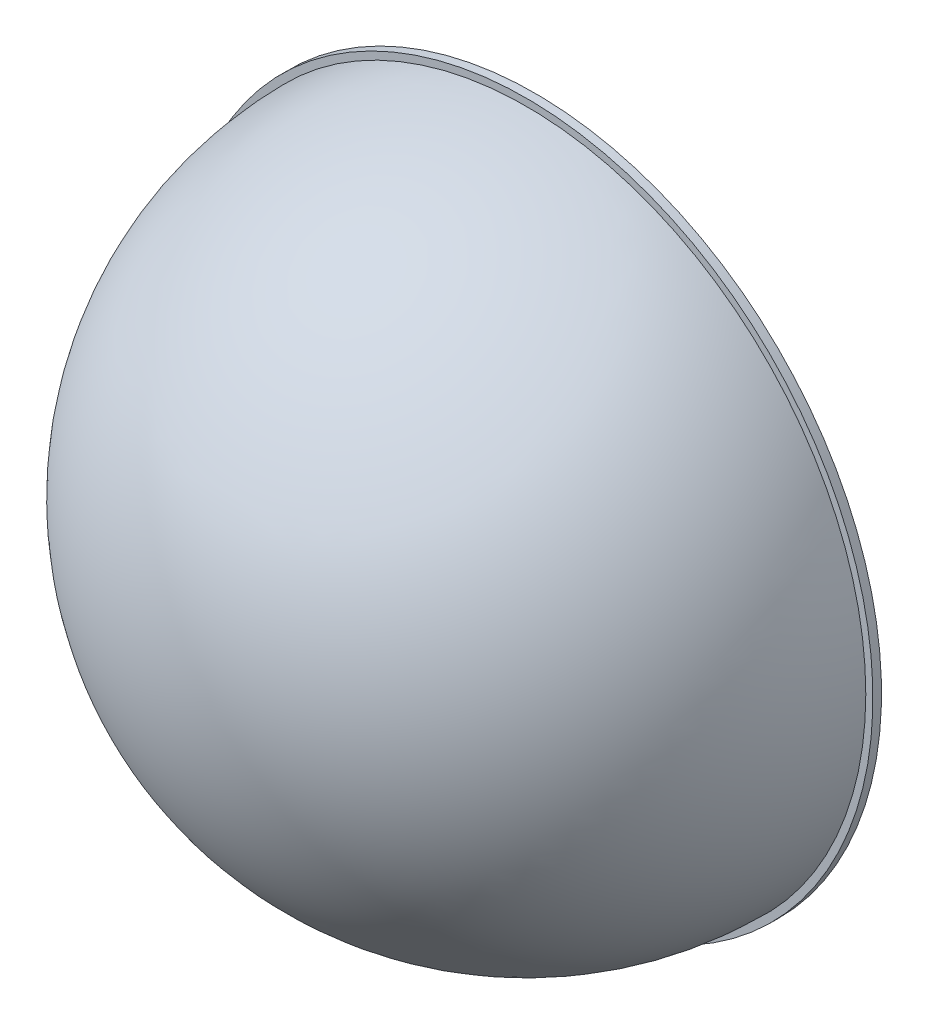
ISO-10303-21;
HEADER;
FILE_DESCRIPTION(('STEP AP214'),'2;1');
FILE_NAME('part.step','',(''),(''),'','','');
FILE_SCHEMA(('AUTOMOTIVE_DESIGN { 1 0 10303 214 1 1 1 1 }'));
ENDSEC;
DATA;
#1=APPLICATION_CONTEXT('core data for automotive mechanical design processes');
#2=APPLICATION_PROTOCOL_DEFINITION('international standard','automotive_design',2000,#1);
#3=PRODUCT_CONTEXT('',#1,'mechanical');
#4=PRODUCT('Part','Part','',(#3));
#5=PRODUCT_RELATED_PRODUCT_CATEGORY('part','',(#4));
#6=PRODUCT_DEFINITION_FORMATION('','',#4);
#7=PRODUCT_DEFINITION_CONTEXT('part definition',#1,'design');
#8=PRODUCT_DEFINITION('design','',#6,#7);
#9=PRODUCT_DEFINITION_SHAPE('','',#8);
#10=(LENGTH_UNIT() NAMED_UNIT(*) SI_UNIT(.MILLI.,.METRE.));
#11=(NAMED_UNIT(*) PLANE_ANGLE_UNIT() SI_UNIT($,.RADIAN.));
#12=(NAMED_UNIT(*) SI_UNIT($,.STERADIAN.) SOLID_ANGLE_UNIT());
#13=UNCERTAINTY_MEASURE_WITH_UNIT(LENGTH_MEASURE(1.E-05),#10,'distance_accuracy_value','');
#14=(GEOMETRIC_REPRESENTATION_CONTEXT(3) GLOBAL_UNCERTAINTY_ASSIGNED_CONTEXT((#13)) GLOBAL_UNIT_ASSIGNED_CONTEXT((#10,
#11,#12)) REPRESENTATION_CONTEXT('',''));
#15=CARTESIAN_POINT('',(0.,0.,0.));
#16=DIRECTION('',(0.,0.,1.));
#17=DIRECTION('',(1.,0.,0.));
#18=AXIS2_PLACEMENT_3D('',#15,#16,#17);
#19=CARTESIAN_POINT('',(0.,0.,0.));
#20=DIRECTION('',(0.,-1.,0.));
#21=DIRECTION('',(1.,0.,0.));
#22=AXIS2_PLACEMENT_3D('',#19,#20,#21);
#23=SPHERICAL_SURFACE('',#22,78.85);
#24=CARTESIAN_POINT('',(0.,0.,0.));
#25=DIRECTION('',(0.,0.,-1.));
#26=DIRECTION('',(-1.,0.,0.));
#27=AXIS2_PLACEMENT_3D('',#24,#25,#26);
#28=SPHERICAL_SURFACE('',#27,78.85);
#29=CARTESIAN_POINT('',(0.,0.,0.));
#30=DIRECTION('',(0.,0.,-1.));
#31=DIRECTION('',(-1.,0.,0.));
#32=AXIS2_PLACEMENT_3D('',#29,#30,#31);
#33=CIRCLE('',#32,78.85);
#34=CARTESIAN_POINT('',(-78.85,0.,3.04272323601612E-13));
#35=VERTEX_POINT('',#34);
#36=EDGE_CURVE('E10',#35,#35,#33,.T.);
#37=ORIENTED_EDGE('',*,*,#36,.F.);
#38=EDGE_LOOP('',(#37));
#39=FACE_BOUND('',#38,.T.);
#40=ADVANCED_FACE('F33',(#39),#28,.T.);
#41=CARTESIAN_POINT('',(0.,0.,0.));
#42=DIRECTION('',(0.,0.,-1.));
#43=DIRECTION('',(-1.,0.,0.));
#44=AXIS2_PLACEMENT_3D('',#41,#42,#43);
#45=PLANE('',#44);
#46=CARTESIAN_POINT('',(0.,0.,0.));
#47=DIRECTION('',(0.,0.,-1.));
#48=DIRECTION('',(-1.,0.,0.));
#49=AXIS2_PLACEMENT_3D('',#46,#47,#48);
#50=CIRCLE('',#49,80.5);
#51=CARTESIAN_POINT('',(-80.5,0.,2.81064247776872E-13));
#52=VERTEX_POINT('',#51);
#53=EDGE_CURVE('E43',#52,#52,#50,.T.);
#54=ORIENTED_EDGE('',*,*,#53,.F.);
#55=EDGE_LOOP('',(#54));
#56=FACE_BOUND('',#55,.T.);
#57=ORIENTED_EDGE('',*,*,#36,.T.);
#58=EDGE_LOOP('',(#57));
#59=FACE_BOUND('',#58,.T.);
#60=ADVANCED_FACE('F62',(#56,#59),#45,.F.);
#61=CARTESIAN_POINT('',(0.,0.,-2.));
#62=DIRECTION('',(0.,0.,-1.));
#63=DIRECTION('',(-1.,0.,0.));
#64=AXIS2_PLACEMENT_3D('',#61,#62,#63);
#65=PLANE('',#64);
#66=CARTESIAN_POINT('',(0.,0.,-2.));
#67=DIRECTION('',(0.,0.,-1.));
#68=DIRECTION('',(-1.,0.,0.));
#69=AXIS2_PLACEMENT_3D('',#66,#67,#68);
#70=CIRCLE('',#69,80.5);
#71=CARTESIAN_POINT('',(-80.5,0.,-1.99999999999972));
#72=VERTEX_POINT('',#71);
#73=EDGE_CURVE('E39',#72,#72,#70,.T.);
#74=ORIENTED_EDGE('',*,*,#73,.T.);
#75=EDGE_LOOP('',(#74));
#76=FACE_BOUND('',#75,.T.);
#77=CARTESIAN_POINT('',(0.,0.,-2.));
#78=DIRECTION('',(0.,0.,-1.));
#79=DIRECTION('',(-1.,0.,0.));
#80=AXIS2_PLACEMENT_3D('',#77,#78,#79);
#81=CIRCLE('',#80,76.85);
#82=CARTESIAN_POINT('',(-76.85,0.,-1.99999999999973));
#83=VERTEX_POINT('',#82);
#84=EDGE_CURVE('E48',#83,#83,#81,.T.);
#85=ORIENTED_EDGE('',*,*,#84,.F.);
#86=EDGE_LOOP('',(#85));
#87=FACE_BOUND('',#86,.T.);
#88=ADVANCED_FACE('F59',(#76,#87),#65,.T.);
#89=CARTESIAN_POINT('',(0.,0.,-2.));
#90=DIRECTION('',(0.,0.,1.));
#91=DIRECTION('',(1.,0.,0.));
#92=AXIS2_PLACEMENT_3D('',#89,#90,#91);
#93=CYLINDRICAL_SURFACE('',#92,80.5);
#94=ORIENTED_EDGE('',*,*,#73,.F.);
#95=EDGE_LOOP('',(#94));
#96=FACE_BOUND('',#95,.T.);
#97=ORIENTED_EDGE('',*,*,#53,.T.);
#98=EDGE_LOOP('',(#97));
#99=FACE_BOUND('',#98,.T.);
#100=ADVANCED_FACE('F61',(#96,#99),#93,.T.);
#101=CARTESIAN_POINT('',(0.,0.,-2.));
#102=DIRECTION('',(0.,0.,1.));
#103=DIRECTION('',(1.,0.,0.));
#104=AXIS2_PLACEMENT_3D('',#101,#102,#103);
#105=CYLINDRICAL_SURFACE('',#104,76.85);
#106=ORIENTED_EDGE('',*,*,#84,.T.);
#107=EDGE_LOOP('',(#106));
#108=FACE_BOUND('',#107,.T.);
#109=CARTESIAN_POINT('',(0.,0.,0.));
#110=DIRECTION('',(0.,0.,-1.));
#111=DIRECTION('',(-1.,0.,0.));
#112=AXIS2_PLACEMENT_3D('',#109,#110,#111);
#113=CIRCLE('',#112,76.85);
#114=CARTESIAN_POINT('',(-76.85,0.,2.68320340890095E-13));
#115=VERTEX_POINT('',#114);
#116=EDGE_CURVE('E50',#115,#115,#113,.T.);
#117=ORIENTED_EDGE('',*,*,#116,.F.);
#118=EDGE_LOOP('',(#117));
#119=FACE_BOUND('',#118,.T.);
#120=ADVANCED_FACE('F56',(#108,#119),#105,.F.);
#121=CARTESIAN_POINT('',(0.,0.,0.));
#122=DIRECTION('',(0.,-1.,0.));
#123=DIRECTION('',(1.,0.,0.));
#124=AXIS2_PLACEMENT_3D('',#121,#122,#123);
#125=SPHERICAL_SURFACE('',#124,76.85);
#126=CARTESIAN_POINT('',(0.,0.,0.));
#127=DIRECTION('',(0.,0.,-1.));
#128=DIRECTION('',(-1.,0.,0.));
#129=AXIS2_PLACEMENT_3D('',#126,#127,#128);
#130=SPHERICAL_SURFACE('',#129,76.85);
#131=ORIENTED_EDGE('',*,*,#116,.T.);
#132=EDGE_LOOP('',(#131));
#133=FACE_BOUND('',#132,.T.);
#134=ADVANCED_FACE('F88',(#133),#130,.F.);
#135=CLOSED_SHELL('',(#40,#60,#88,#100,#120,#134));
#136=MANIFOLD_SOLID_BREP('B2',#135);
#137=ADVANCED_BREP_SHAPE_REPRESENTATION('',(#18,#136),#14);
#138=SHAPE_DEFINITION_REPRESENTATION(#9,#137);
ENDSEC;
END-ISO-10303-21;
